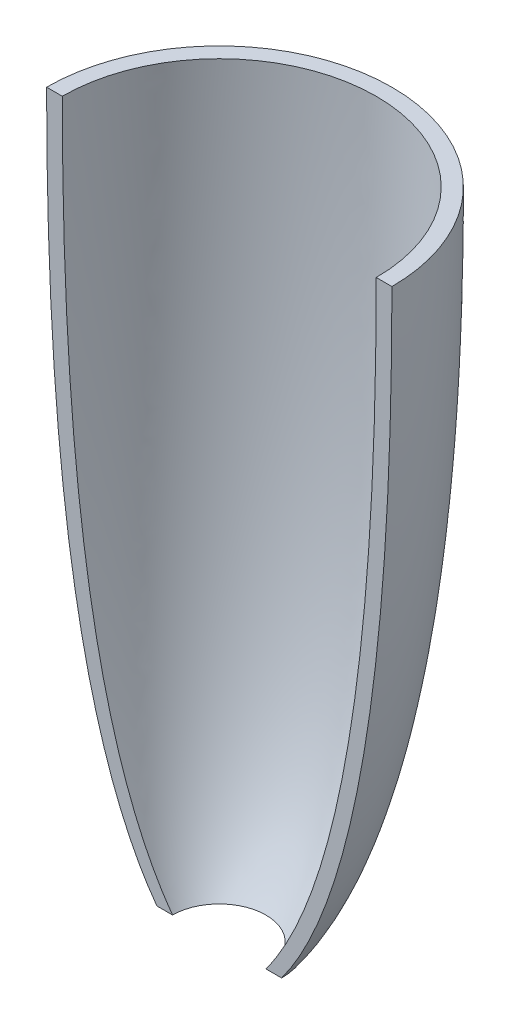
ISO-10303-21;
HEADER;
FILE_DESCRIPTION(('STEP AP214'),'2;1');
FILE_NAME('part.step','',(''),(''),'','','');
FILE_SCHEMA(('AUTOMOTIVE_DESIGN { 1 0 10303 214 1 1 1 1 }'));
ENDSEC;
DATA;
#1=APPLICATION_CONTEXT('core data for automotive mechanical design processes');
#2=APPLICATION_PROTOCOL_DEFINITION('international standard','automotive_design',2000,#1);
#3=PRODUCT_CONTEXT('',#1,'mechanical');
#4=PRODUCT('Part','Part','',(#3));
#5=PRODUCT_RELATED_PRODUCT_CATEGORY('part','',(#4));
#6=PRODUCT_DEFINITION_FORMATION('','',#4);
#7=PRODUCT_DEFINITION_CONTEXT('part definition',#1,'design');
#8=PRODUCT_DEFINITION('design','',#6,#7);
#9=PRODUCT_DEFINITION_SHAPE('','',#8);
#10=(LENGTH_UNIT() NAMED_UNIT(*) SI_UNIT(.MILLI.,.METRE.));
#11=(NAMED_UNIT(*) PLANE_ANGLE_UNIT() SI_UNIT($,.RADIAN.));
#12=(NAMED_UNIT(*) SI_UNIT($,.STERADIAN.) SOLID_ANGLE_UNIT());
#13=UNCERTAINTY_MEASURE_WITH_UNIT(LENGTH_MEASURE(1.E-05),#10,'distance_accuracy_value','');
#14=(GEOMETRIC_REPRESENTATION_CONTEXT(3) GLOBAL_UNCERTAINTY_ASSIGNED_CONTEXT((#13)) GLOBAL_UNIT_ASSIGNED_CONTEXT((#10,
#11,#12)) REPRESENTATION_CONTEXT('',''));
#15=CARTESIAN_POINT('',(0.,0.,0.));
#16=DIRECTION('',(0.,0.,1.));
#17=DIRECTION('',(1.,0.,0.));
#18=AXIS2_PLACEMENT_3D('',#15,#16,#17);
#19=CARTESIAN_POINT('',(-29.9997473066322,124.995387397587,2.09487115782232E-13));
#20=CARTESIAN_POINT('',(-29.9997447874864,124.491558358639,2.0948709819113E-13));
#21=CARTESIAN_POINT('',(-29.9987787165622,123.466958812882,2.09480352153923E-13));
#22=CARTESIAN_POINT('',(-29.9944090386209,121.492804005255,2.09449838855945E-13));
#23=CARTESIAN_POINT('',(-29.9826010698833,119.425003129462,2.09367384250951E-13));
#24=CARTESIAN_POINT('',(-29.9646526026086,117.075078816578,2.0924205077385E-13));
#25=CARTESIAN_POINT('',(-29.9404058409812,114.869694197958,2.09072736542352E-13));
#26=CARTESIAN_POINT('',(-29.9020123318384,112.031134847052,2.08804636100942E-13));
#27=CARTESIAN_POINT('',(-29.8228729478538,107.53773661096,2.08252008736242E-13));
#28=CARTESIAN_POINT('',(-29.6975285859,102.459699855678,2.0737673373486E-13));
#29=CARTESIAN_POINT('',(-29.5081654611885,96.8343120399124,2.06054418102471E-13));
#30=CARTESIAN_POINT('',(-29.2150551519267,90.0777134681548,2.0400763975245E-13));
#31=CARTESIAN_POINT('',(-28.851799071317,83.3285750874597,2.0147103609911E-13));
#32=CARTESIAN_POINT('',(-28.3920476272803,76.5823447109337,1.98260608924389E-13));
#33=CARTESIAN_POINT('',(-27.821206455192,69.8464604038847,1.9427444632481E-13));
#34=CARTESIAN_POINT('',(-27.1504104892118,63.1189742116847,1.89590303130028E-13));
#35=CARTESIAN_POINT('',(-26.3712007025939,56.4034499582913,1.84149110271987E-13));
#36=CARTESIAN_POINT('',(-25.3160334761119,48.8265833684193,1.76780916910746E-13));
#37=CARTESIAN_POINT('',(-24.0185744155475,41.287276738858,1.67720808714998E-13));
#38=CARTESIAN_POINT('',(-22.7036895112954,34.8980222278364,1.58539016503153E-13));
#39=CARTESIAN_POINT('',(-21.4547676864107,29.6487269486284,1.49817842012635E-13));
#40=CARTESIAN_POINT('',(-20.2906723472268,25.2940697911004,1.41689007705845E-13));
#41=CARTESIAN_POINT('',(-19.0317187088168,21.1212201560716,1.32897781435891E-13));
#42=CARTESIAN_POINT('',(-17.7470521004091,17.3509464710786,1.2392700245611E-13));
#43=CARTESIAN_POINT('',(-16.5938487679613,14.3319598869117,1.15874226625844E-13));
#44=CARTESIAN_POINT('',(-15.6378569934568,12.0434135327781,1.09198571744304E-13));
#45=CARTESIAN_POINT('',(-14.9525349590064,10.508297608708,1.04412993555541E-13));
#46=CARTESIAN_POINT('',(-14.4845083601107,9.50329673627208,1.01144781283288E-13));
#47=CARTESIAN_POINT('',(-14.0886614913739,8.68184667819431,0.));
#48=CARTESIAN_POINT('',(-13.7719512110495,8.04097627201709,0.));
#49=CARTESIAN_POINT('',(-13.4019167239576,7.31133049588283,0.));
#50=CARTESIAN_POINT('',(-12.9752535226437,6.49562011593832,0.));
#51=CARTESIAN_POINT('',(-12.4864656198334,5.59533532620717,0.));
#52=CARTESIAN_POINT('',(-11.9312627656813,4.61577373735972,0.));
#53=CARTESIAN_POINT('',(-11.3705982264811,3.67032918306545,0.));
#54=CARTESIAN_POINT('',(-10.8087922472565,2.76372337614413,0.));
#55=CARTESIAN_POINT('',(-10.3172121007878,2.00563426283377,0.));
#56=CARTESIAN_POINT('',(-9.91315853678728,1.40383225694617,0.));
#57=CARTESIAN_POINT('',(-9.57121058453632,0.909784822580683,0.));
#58=CARTESIAN_POINT('',(-9.32614520203676,0.561662718177499,0.));
#59=CARTESIAN_POINT('',(-9.09861696911954,0.246765576625241,0.));
#60=CARTESIAN_POINT('',(-8.97762183484092,0.0810822259581389,0.));
#61=CARTESIAN_POINT('',(-8.91789656381425,-6.55151273561598E-05,0.));
#62=B_SPLINE_CURVE_WITH_KNOTS('',4,(#19,#20,#21,#22,#23,#24,#25,#26,#27,#28,#29,#30,#31,#32,#33,
#34,#35,#36,#37,#38,#39,#40,#41,#42,#43,#44,#45,#46,#47,#48,#49,#50,#51,#52,#53,#54,#55,#56,#57,
#58,#59,#60,#61),.UNSPECIFIED.,.F.,.F.,(5,1,1,1,1,1,1,1,1,1,1,1,1,1,1,1,1,1,1,1,1,1,1,1,1,1,1,1,
1,1,1,1,1,1,1,1,1,1,1,5),(0.0873610973549176,0.103066113357134,0.11877112935935,
0.134476145361567,0.150181161363783,0.165886111425333,0.181591061486883,0.213000961609982,
0.275820149389448,0.307229874773122,0.338639600156796,0.401458089652161,0.464277390872694,
0.495687130013036,0.527096869153377,0.589916133940755,0.652735207395345,0.708908673175042,
0.740317932943272,0.771727885787614,0.80313743289368,0.83454682058873,0.8617992641974,
0.882738909412403,0.89320871613313,0.903678522853857,0.908661145155612,0.913643767457367,
0.918626389759122,0.923609012060877,0.931461731709436,0.939314451357996,0.94716690728162,
0.955019363205244,0.962063809457351,0.969108255709459,0.972248998408458,0.975389741107458,
0.978530483806458,0.981671226505457),.UNSPECIFIED.);
#63=CARTESIAN_POINT('',(0.,0.,0.));
#64=DIRECTION('',(0.,-1.,0.));
#65=AXIS1_PLACEMENT('',#63,#64);
#66=SURFACE_OF_REVOLUTION('',#62,#65);
#67=CARTESIAN_POINT('',(0.,-6.55151267224922E-05,0.));
#68=DIRECTION('',(0.,-1.,0.));
#69=DIRECTION('',(0.,0.,-1.));
#70=AXIS2_PLACEMENT_3D('',#67,#68,#69);
#71=CIRCLE('',#70,8.91789656380857);
#72=CARTESIAN_POINT('',(-8.91789656380857,-6.55151267224922E-05,0.));
#73=VERTEX_POINT('',#72);
#74=CARTESIAN_POINT('',(8.91789656380857,-6.55151267224922E-05,0.));
#75=VERTEX_POINT('',#74);
#76=EDGE_CURVE('E11',#73,#75,#71,.T.);
#77=ORIENTED_EDGE('',*,*,#76,.T.);
#78=CARTESIAN_POINT('',(29.9997473066322,124.995387397587,0.));
#79=CARTESIAN_POINT('',(29.9997447874864,124.491558358639,0.));
#80=CARTESIAN_POINT('',(29.9987787165622,123.466958812882,0.));
#81=CARTESIAN_POINT('',(29.9944090386209,121.492804005255,0.));
#82=CARTESIAN_POINT('',(29.9826010698833,119.425003129462,0.));
#83=CARTESIAN_POINT('',(29.9646526026086,117.075078816578,0.));
#84=CARTESIAN_POINT('',(29.9404058409812,114.869694197958,0.));
#85=CARTESIAN_POINT('',(29.9020123318384,112.031134847052,0.));
#86=CARTESIAN_POINT('',(29.8228729478538,107.53773661096,0.));
#87=CARTESIAN_POINT('',(29.6975285859,102.459699855678,0.));
#88=CARTESIAN_POINT('',(29.5081654611885,96.8343120399124,0.));
#89=CARTESIAN_POINT('',(29.2150551519267,90.0777134681548,0.));
#90=CARTESIAN_POINT('',(28.851799071317,83.3285750874597,0.));
#91=CARTESIAN_POINT('',(28.3920476272803,76.5823447109337,0.));
#92=CARTESIAN_POINT('',(27.821206455192,69.8464604038847,0.));
#93=CARTESIAN_POINT('',(27.1504104892118,63.1189742116847,0.));
#94=CARTESIAN_POINT('',(26.3712007025939,56.4034499582913,0.));
#95=CARTESIAN_POINT('',(25.3160334761119,48.8265833684193,0.));
#96=CARTESIAN_POINT('',(24.0185744155475,41.287276738858,0.));
#97=CARTESIAN_POINT('',(22.7036895112954,34.8980222278364,0.));
#98=CARTESIAN_POINT('',(21.4547676864107,29.6487269486284,0.));
#99=CARTESIAN_POINT('',(20.2906723472268,25.2940697911004,0.));
#100=CARTESIAN_POINT('',(19.0317187088168,21.1212201560716,0.));
#101=CARTESIAN_POINT('',(17.7470521004091,17.3509464710786,0.));
#102=CARTESIAN_POINT('',(16.5938487679613,14.3319598869117,0.));
#103=CARTESIAN_POINT('',(15.6378569934568,12.0434135327781,0.));
#104=CARTESIAN_POINT('',(14.9525349590064,10.508297608708,0.));
#105=CARTESIAN_POINT('',(14.4845083601107,9.50329673627208,0.));
#106=CARTESIAN_POINT('',(14.0886614913739,8.68184667819431,0.));
#107=CARTESIAN_POINT('',(13.7719512110495,8.04097627201709,0.));
#108=CARTESIAN_POINT('',(13.4019167239576,7.31133049588283,0.));
#109=CARTESIAN_POINT('',(12.9752535226437,6.49562011593832,0.));
#110=CARTESIAN_POINT('',(12.4864656198334,5.59533532620717,0.));
#111=CARTESIAN_POINT('',(11.9312627656813,4.61577373735972,0.));
#112=CARTESIAN_POINT('',(11.3705982264811,3.67032918306545,0.));
#113=CARTESIAN_POINT('',(10.8087922472565,2.76372337614413,0.));
#114=CARTESIAN_POINT('',(10.3172121007878,2.00563426283377,0.));
#115=CARTESIAN_POINT('',(9.91315853678728,1.40383225694617,0.));
#116=CARTESIAN_POINT('',(9.57121058453632,0.909784822580683,0.));
#117=CARTESIAN_POINT('',(9.32614520203676,0.561662718177499,0.));
#118=CARTESIAN_POINT('',(9.09861696911954,0.246765576625241,0.));
#119=CARTESIAN_POINT('',(8.97762183484092,0.0810822259581389,0.));
#120=CARTESIAN_POINT('',(8.91789656381425,-6.55151273561598E-05,0.));
#121=B_SPLINE_CURVE_WITH_KNOTS('',4,(#78,#79,#80,#81,#82,#83,#84,#85,#86,#87,#88,#89,#90,#91,
#92,#93,#94,#95,#96,#97,#98,#99,#100,#101,#102,#103,#104,#105,#106,#107,#108,#109,#110,#111,
#112,#113,#114,#115,#116,#117,#118,#119,#120),.UNSPECIFIED.,.F.,.F.,(5,1,1,1,1,1,1,1,1,1,1,1,1,
1,1,1,1,1,1,1,1,1,1,1,1,1,1,1,1,1,1,1,1,1,1,1,1,1,1,5),(0.0873610973549176,0.103066113357134,
0.11877112935935,0.134476145361567,0.150181161363783,0.165886111425333,0.181591061486883,
0.213000961609982,0.275820149389448,0.307229874773122,0.338639600156796,0.401458089652161,
0.464277390872694,0.495687130013036,0.527096869153377,0.589916133940755,0.652735207395345,
0.708908673175042,0.740317932943272,0.771727885787614,0.80313743289368,0.83454682058873,
0.8617992641974,0.882738909412403,0.89320871613313,0.903678522853857,0.908661145155612,
0.913643767457367,0.918626389759122,0.923609012060877,0.931461731709436,0.939314451357996,
0.94716690728162,0.955019363205244,0.962063809457351,0.969108255709459,0.972248998408458,
0.975389741107458,0.978530483806458,0.981671226505457),.UNSPECIFIED.);
#122=CARTESIAN_POINT('',(29.9997473066322,124.9953873977,0.));
#123=VERTEX_POINT('',#122);
#124=EDGE_CURVE('E86',#123,#75,#121,.T.);
#125=ORIENTED_EDGE('',*,*,#124,.F.);
#126=CARTESIAN_POINT('',(0.,124.9953873977,0.));
#127=DIRECTION('',(0.,-1.,0.));
#128=DIRECTION('',(0.,0.,-1.));
#129=AXIS2_PLACEMENT_3D('',#126,#127,#128);
#130=CIRCLE('',#129,29.9997473066322);
#131=CARTESIAN_POINT('',(-29.9997473066322,124.9953873977,2.09487115782232E-13));
#132=VERTEX_POINT('',#131);
#133=EDGE_CURVE('E61',#132,#123,#130,.T.);
#134=ORIENTED_EDGE('',*,*,#133,.F.);
#135=EDGE_CURVE('E88',#132,#73,#62,.T.);
#136=ORIENTED_EDGE('',*,*,#135,.T.);
#137=EDGE_LOOP('',(#77,#125,#134,#136));
#138=FACE_BOUND('',#137,.T.);
#139=ADVANCED_FACE('F45',(#138),#66,.F.);
#140=CARTESIAN_POINT('',(-11.9178965637993,-6.55151269181249E-05,0.));
#141=DIRECTION('',(0.,-1.,0.));
#142=DIRECTION('',(0.,0.,-1.));
#143=AXIS2_PLACEMENT_3D('',#140,#141,#142);
#144=PLANE('',#143);
#145=CARTESIAN_POINT('',(0.,-6.55151271137576E-05,0.));
#146=DIRECTION('',(0.,-1.,0.));
#147=DIRECTION('',(0.,0.,-1.));
#148=AXIS2_PLACEMENT_3D('',#145,#146,#147);
#149=CIRCLE('',#148,11.9178965638047);
#150=CARTESIAN_POINT('',(-11.9178965638047,-6.55151271137576E-05,0.));
#151=VERTEX_POINT('',#150);
#152=CARTESIAN_POINT('',(11.9178965638047,-6.55151271137576E-05,0.));
#153=VERTEX_POINT('',#152);
#154=EDGE_CURVE('E54',#151,#153,#149,.T.);
#155=ORIENTED_EDGE('',*,*,#154,.T.);
#156=DIRECTION('',(1.,0.,0.));
#157=VECTOR('',#156,1.);
#158=CARTESIAN_POINT('',(11.9178965637993,-6.55151267221248E-05,0.));
#159=LINE('',#158,#157);
#160=EDGE_CURVE('E97',#75,#153,#159,.T.);
#161=ORIENTED_EDGE('',*,*,#160,.F.);
#162=ORIENTED_EDGE('',*,*,#76,.F.);
#163=DIRECTION('',(-1.,0.,0.));
#164=VECTOR('',#163,1.);
#165=CARTESIAN_POINT('',(-11.9178965637993,-6.55151267221248E-05,0.));
#166=LINE('',#165,#164);
#167=EDGE_CURVE('E122',#73,#151,#166,.T.);
#168=ORIENTED_EDGE('',*,*,#167,.T.);
#169=EDGE_LOOP('',(#155,#161,#162,#168));
#170=FACE_BOUND('',#169,.T.);
#171=ADVANCED_FACE('F47',(#170),#144,.T.);
#172=CARTESIAN_POINT('',(-11.9178965638047,-6.55151271137576E-05,0.));
#173=CARTESIAN_POINT('',(-11.9776218348323,0.0810822259578884,0.));
#174=CARTESIAN_POINT('',(-12.0986169691128,0.246765576623764,0.));
#175=CARTESIAN_POINT('',(-12.3261452020336,0.561662718173813,0.));
#176=CARTESIAN_POINT('',(-12.571210584537,0.90978482257453,0.));
#177=CARTESIAN_POINT('',(-12.9131585367933,1.40383225693633,0.));
#178=CARTESIAN_POINT('',(-13.3172121008004,2.00563426281958,0.));
#179=CARTESIAN_POINT('',(-13.808792247277,2.76372337612464,0.));
#180=CARTESIAN_POINT('',(-14.3705982265117,3.67032918303991,1.00349351071756E-13));
#181=CARTESIAN_POINT('',(-14.9312627657217,4.61577373732814,1.04264450623761E-13));
#182=CARTESIAN_POINT('',(-15.4864656198849,5.59533532616961,1.08141411432928E-13));
#183=CARTESIAN_POINT('',(-15.9752535227043,6.49562011589549,1.1155459911562E-13));
#184=CARTESIAN_POINT('',(-16.4019167240275,7.31133049583541,1.14533972326402E-13));
#185=CARTESIAN_POINT('',(-16.7719512111269,8.04097627196569,1.17117909339274E-13));
#186=CARTESIAN_POINT('',(-17.0886614914585,8.68184667813948,1.19329485406469E-13));
#187=CARTESIAN_POINT('',(-17.4845083602039,9.50329673621299,1.22093669316997E-13));
#188=CARTESIAN_POINT('',(-17.9525349591106,10.5082976086438,1.25361881589327E-13));
#189=CARTESIAN_POINT('',(-18.6378569935774,12.0434135327066,1.30147459778205E-13));
#190=CARTESIAN_POINT('',(-19.5938487681068,14.3319598868299,1.36823114659919E-13));
#191=CARTESIAN_POINT('',(-20.7470521005865,17.3509464709844,1.44875890490408E-13));
#192=CARTESIAN_POINT('',(-22.0317187090359,21.1212201559635,1.5384666947048E-13));
#193=CARTESIAN_POINT('',(-23.2906723474896,25.2940697909788,1.62637895740739E-13));
#194=CARTESIAN_POINT('',(-24.4547676867216,29.6487269484942,1.70766730047865E-13));
#195=CARTESIAN_POINT('',(-25.7036895116619,34.8980222276888,1.79487904538771E-13));
#196=CARTESIAN_POINT('',(-27.0185744159833,41.2872767386962,1.88669696751101E-13));
#197=CARTESIAN_POINT('',(-28.3160334766289,48.8265833682435,1.97729804947415E-13));
#198=CARTESIAN_POINT('',(-29.3712007031924,56.4034499581041,2.05097998309225E-13));
#199=CARTESIAN_POINT('',(-30.1504104898827,63.1189742114892,2.10539191167771E-13));
#200=CARTESIAN_POINT('',(-30.8212064559353,69.8464604036819,2.15223334363059E-13));
#201=CARTESIAN_POINT('',(-31.3920476280963,76.5823447107249,2.19209496963146E-13));
#202=CARTESIAN_POINT('',(-31.8517990722056,83.3285750872459,2.22419924138374E-13));
#203=CARTESIAN_POINT('',(-32.2150551528878,90.077713467937,2.2495652779222E-13));
#204=CARTESIAN_POINT('',(-32.508165462223,96.8343120396916,2.27003306142753E-13));
#205=CARTESIAN_POINT('',(-32.6975285869941,102.459699855455,2.2832562177556E-13));
#206=CARTESIAN_POINT('',(-32.8228729490037,107.537736610735,2.29200896777331E-13));
#207=CARTESIAN_POINT('',(-32.902012333036,112.031134846827,2.29753524142364E-13));
#208=CARTESIAN_POINT('',(-32.9404058422097,114.869694197733,2.30021624583989E-13));
#209=CARTESIAN_POINT('',(-32.9646526038607,117.075078816353,2.30190938815653E-13));
#210=CARTESIAN_POINT('',(-32.9826010711607,119.425003129236,2.3031627229293E-13));
#211=CARTESIAN_POINT('',(-32.9944090399211,121.492804005087,2.30398726898083E-13));
#212=CARTESIAN_POINT('',(-32.9987787178836,123.466958812803,2.30429240196209E-13));
#213=CARTESIAN_POINT('',(-32.9997447888186,124.491558358585,2.30435986233492E-13));
#214=CARTESIAN_POINT('',(-32.9997473079697,124.995387397587,2.30436003824631E-13));
#215=B_SPLINE_CURVE_WITH_KNOTS('',4,(#172,#173,#174,#175,#176,#177,#178,#179,#180,#181,#182,
#183,#184,#185,#186,#187,#188,#189,#190,#191,#192,#193,#194,#195,#196,#197,#198,#199,#200,#201,
#202,#203,#204,#205,#206,#207,#208,#209,#210,#211,#212,#213,#214),.UNSPECIFIED.,.F.,.F.,(5,1,1,
1,1,1,1,1,1,1,1,1,1,1,1,1,1,1,1,1,1,1,1,1,1,1,1,1,1,1,1,1,1,1,1,1,1,1,1,5),(0.0873610973549176,
0.0905018400539172,0.0936425827529169,0.0967833254519167,0.0999240681509164,0.106968514403024,
0.114012960655131,0.121865416578755,0.129717872502379,0.137570592150939,0.145423311799498,
0.150405934101253,0.155388556403008,0.160371178704763,0.165353801006518,0.175823607727245,
0.186293414447972,0.207233059662975,0.234485503271645,0.265894890966695,0.297304438072761,
0.328714390917103,0.360123650685333,0.41629711646503,0.47911618991962,0.541935454706998,
0.573345193847339,0.604754932987681,0.667574234208214,0.730392723703579,0.761802449087253,
0.793212174470927,0.856031362250393,0.887441262373492,0.903146212435042,0.918851162496592,
0.934556178498808,0.950261194501025,0.965966210503241,0.981671226505457),.UNSPECIFIED.);
#216=CARTESIAN_POINT('',(0.,0.,0.));
#217=DIRECTION('',(0.,-1.,0.));
#218=AXIS1_PLACEMENT('',#216,#217);
#219=SURFACE_OF_REVOLUTION('',#215,#218);
#220=CARTESIAN_POINT('',(0.,124.9953873977,0.));
#221=DIRECTION('',(0.,-1.,0.));
#222=DIRECTION('',(0.,0.,-1.));
#223=AXIS2_PLACEMENT_3D('',#220,#221,#222);
#224=CIRCLE('',#223,32.9997473079697);
#225=CARTESIAN_POINT('',(-32.9997473079697,124.9953873977,2.30436003824631E-13));
#226=VERTEX_POINT('',#225);
#227=CARTESIAN_POINT('',(32.9997473079697,124.9953873977,0.));
#228=VERTEX_POINT('',#227);
#229=EDGE_CURVE('E69',#226,#228,#224,.T.);
#230=ORIENTED_EDGE('',*,*,#229,.T.);
#231=CARTESIAN_POINT('',(11.9178965638047,-6.55151271137576E-05,0.));
#232=CARTESIAN_POINT('',(11.9776218348323,0.0810822259578884,0.));
#233=CARTESIAN_POINT('',(12.0986169691128,0.246765576623764,0.));
#234=CARTESIAN_POINT('',(12.3261452020336,0.561662718173813,0.));
#235=CARTESIAN_POINT('',(12.571210584537,0.90978482257453,0.));
#236=CARTESIAN_POINT('',(12.9131585367933,1.40383225693633,0.));
#237=CARTESIAN_POINT('',(13.3172121008004,2.00563426281958,0.));
#238=CARTESIAN_POINT('',(13.808792247277,2.76372337612464,0.));
#239=CARTESIAN_POINT('',(14.3705982265117,3.67032918303991,0.));
#240=CARTESIAN_POINT('',(14.9312627657217,4.61577373732814,0.));
#241=CARTESIAN_POINT('',(15.4864656198849,5.59533532616961,0.));
#242=CARTESIAN_POINT('',(15.9752535227043,6.49562011589549,0.));
#243=CARTESIAN_POINT('',(16.4019167240275,7.31133049583541,0.));
#244=CARTESIAN_POINT('',(16.7719512111269,8.04097627196569,0.));
#245=CARTESIAN_POINT('',(17.0886614914585,8.68184667813948,0.));
#246=CARTESIAN_POINT('',(17.4845083602039,9.50329673621299,0.));
#247=CARTESIAN_POINT('',(17.9525349591106,10.5082976086438,0.));
#248=CARTESIAN_POINT('',(18.6378569935774,12.0434135327066,0.));
#249=CARTESIAN_POINT('',(19.5938487681068,14.3319598868299,0.));
#250=CARTESIAN_POINT('',(20.7470521005865,17.3509464709844,0.));
#251=CARTESIAN_POINT('',(22.0317187090359,21.1212201559635,0.));
#252=CARTESIAN_POINT('',(23.2906723474896,25.2940697909788,0.));
#253=CARTESIAN_POINT('',(24.4547676867216,29.6487269484942,0.));
#254=CARTESIAN_POINT('',(25.7036895116619,34.8980222276888,0.));
#255=CARTESIAN_POINT('',(27.0185744159833,41.2872767386962,0.));
#256=CARTESIAN_POINT('',(28.3160334766289,48.8265833682435,0.));
#257=CARTESIAN_POINT('',(29.3712007031924,56.4034499581041,0.));
#258=CARTESIAN_POINT('',(30.1504104898827,63.1189742114892,0.));
#259=CARTESIAN_POINT('',(30.8212064559353,69.8464604036819,0.));
#260=CARTESIAN_POINT('',(31.3920476280963,76.5823447107249,0.));
#261=CARTESIAN_POINT('',(31.8517990722056,83.3285750872459,0.));
#262=CARTESIAN_POINT('',(32.2150551528878,90.077713467937,0.));
#263=CARTESIAN_POINT('',(32.508165462223,96.8343120396916,0.));
#264=CARTESIAN_POINT('',(32.6975285869941,102.459699855455,0.));
#265=CARTESIAN_POINT('',(32.8228729490037,107.537736610735,0.));
#266=CARTESIAN_POINT('',(32.902012333036,112.031134846827,0.));
#267=CARTESIAN_POINT('',(32.9404058422097,114.869694197733,0.));
#268=CARTESIAN_POINT('',(32.9646526038607,117.075078816353,0.));
#269=CARTESIAN_POINT('',(32.9826010711607,119.425003129236,0.));
#270=CARTESIAN_POINT('',(32.9944090399211,121.492804005087,0.));
#271=CARTESIAN_POINT('',(32.9987787178836,123.466958812803,0.));
#272=CARTESIAN_POINT('',(32.9997447888186,124.491558358585,0.));
#273=CARTESIAN_POINT('',(32.9997473079697,124.995387397587,0.));
#274=B_SPLINE_CURVE_WITH_KNOTS('',4,(#231,#232,#233,#234,#235,#236,#237,#238,#239,#240,#241,
#242,#243,#244,#245,#246,#247,#248,#249,#250,#251,#252,#253,#254,#255,#256,#257,#258,#259,#260,
#261,#262,#263,#264,#265,#266,#267,#268,#269,#270,#271,#272,#273),.UNSPECIFIED.,.F.,.F.,(5,1,1,
1,1,1,1,1,1,1,1,1,1,1,1,1,1,1,1,1,1,1,1,1,1,1,1,1,1,1,1,1,1,1,1,1,1,1,1,5),(0.0873610973549176,
0.0905018400539172,0.0936425827529169,0.0967833254519167,0.0999240681509164,0.106968514403024,
0.114012960655131,0.121865416578755,0.129717872502379,0.137570592150939,0.145423311799498,
0.150405934101253,0.155388556403008,0.160371178704763,0.165353801006518,0.175823607727245,
0.186293414447972,0.207233059662975,0.234485503271645,0.265894890966695,0.297304438072761,
0.328714390917103,0.360123650685333,0.41629711646503,0.47911618991962,0.541935454706998,
0.573345193847339,0.604754932987681,0.667574234208214,0.730392723703579,0.761802449087253,
0.793212174470927,0.856031362250393,0.887441262373492,0.903146212435042,0.918851162496592,
0.934556178498808,0.950261194501025,0.965966210503241,0.981671226505457),.UNSPECIFIED.);
#275=EDGE_CURVE('E103',#153,#228,#274,.T.);
#276=ORIENTED_EDGE('',*,*,#275,.F.);
#277=ORIENTED_EDGE('',*,*,#154,.F.);
#278=EDGE_CURVE('E138',#151,#226,#215,.T.);
#279=ORIENTED_EDGE('',*,*,#278,.T.);
#280=EDGE_LOOP('',(#230,#276,#277,#279));
#281=FACE_BOUND('',#280,.T.);
#282=ADVANCED_FACE('F135',(#281),#219,.F.);
#283=CARTESIAN_POINT('',(-32.9997473079697,124.9953873977,2.30436003824631E-13));
#284=DIRECTION('',(0.,1.,0.));
#285=DIRECTION('',(0.,0.,1.));
#286=AXIS2_PLACEMENT_3D('',#283,#284,#285);
#287=PLANE('',#286);
#288=DIRECTION('',(1.,0.,0.));
#289=VECTOR('',#288,1.);
#290=CARTESIAN_POINT('',(-32.9997473079697,124.9953873977,2.30436003824631E-13));
#291=LINE('',#290,#289);
#292=EDGE_CURVE('E144',#226,#132,#291,.T.);
#293=ORIENTED_EDGE('',*,*,#292,.T.);
#294=ORIENTED_EDGE('',*,*,#133,.T.);
#295=DIRECTION('',(-1.,0.,0.));
#296=VECTOR('',#295,1.);
#297=CARTESIAN_POINT('',(32.9997473079697,124.9953873977,0.));
#298=LINE('',#297,#296);
#299=EDGE_CURVE('E99',#228,#123,#298,.T.);
#300=ORIENTED_EDGE('',*,*,#299,.F.);
#301=ORIENTED_EDGE('',*,*,#229,.F.);
#302=EDGE_LOOP('',(#293,#294,#300,#301));
#303=FACE_BOUND('',#302,.T.);
#304=ADVANCED_FACE('F133',(#303),#287,.T.);
#305=CARTESIAN_POINT('',(-26.8865760188933,60.9434759640572,1.87747956870707E-13));
#306=DIRECTION('',(0.,0.,-1.));
#307=DIRECTION('',(-1.,0.,0.));
#308=AXIS2_PLACEMENT_3D('',#305,#306,#307);
#309=PLANE('',#308);
#310=ORIENTED_EDGE('',*,*,#135,.F.);
#311=ORIENTED_EDGE('',*,*,#292,.F.);
#312=ORIENTED_EDGE('',*,*,#278,.F.);
#313=ORIENTED_EDGE('',*,*,#167,.F.);
#314=EDGE_LOOP('',(#310,#311,#312,#313));
#315=FACE_BOUND('',#314,.T.);
#316=ADVANCED_FACE('F131',(#315),#309,.F.);
#317=CARTESIAN_POINT('',(26.8865760188933,60.9434759640572,0.));
#318=DIRECTION('',(0.,0.,1.));
#319=DIRECTION('',(1.,0.,0.));
#320=AXIS2_PLACEMENT_3D('',#317,#318,#319);
#321=PLANE('',#320);
#322=ORIENTED_EDGE('',*,*,#124,.T.);
#323=ORIENTED_EDGE('',*,*,#160,.T.);
#324=ORIENTED_EDGE('',*,*,#275,.T.);
#325=ORIENTED_EDGE('',*,*,#299,.T.);
#326=EDGE_LOOP('',(#322,#323,#324,#325));
#327=FACE_BOUND('',#326,.T.);
#328=ADVANCED_FACE('F95',(#327),#321,.T.);
#329=CLOSED_SHELL('',(#139,#171,#282,#304,#316,#328));
#330=MANIFOLD_SOLID_BREP('B2',#329);
#331=ADVANCED_BREP_SHAPE_REPRESENTATION('',(#18,#330),#14);
#332=SHAPE_DEFINITION_REPRESENTATION(#9,#331);
ENDSEC;
END-ISO-10303-21;
